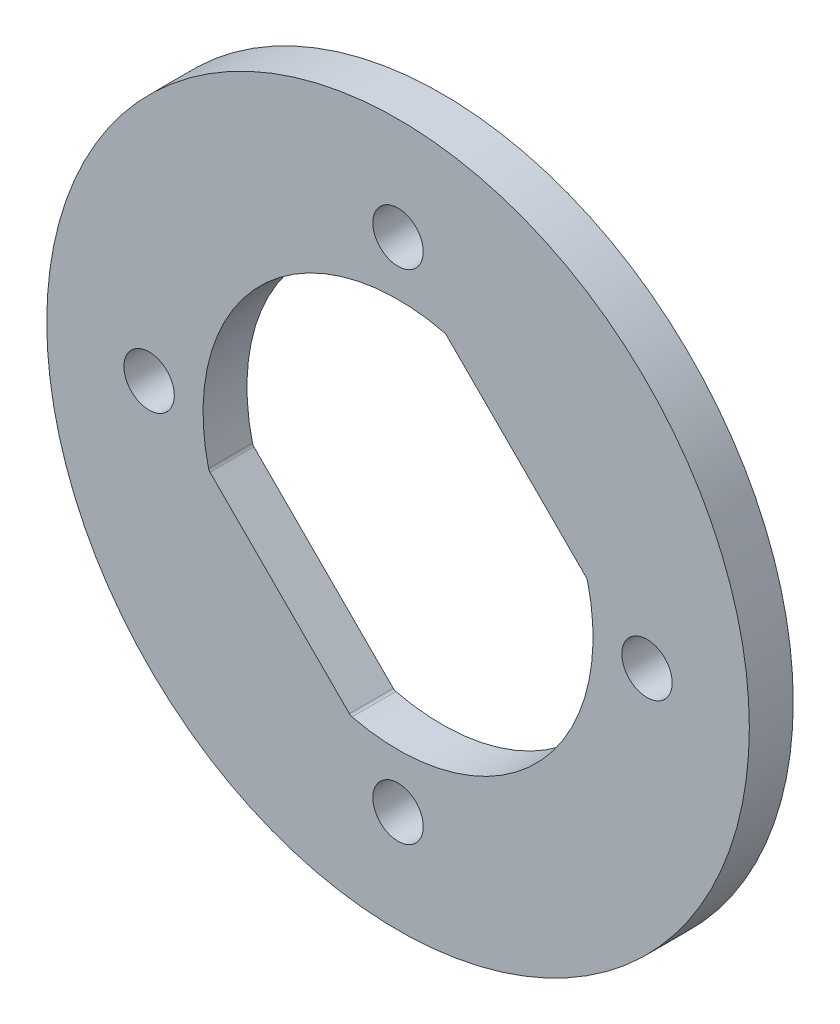
ISO-10303-21;
HEADER;
FILE_DESCRIPTION(('STEP AP214'),'2;1');
FILE_NAME('part.step','',(''),(''),'','','');
FILE_SCHEMA(('AUTOMOTIVE_DESIGN { 1 0 10303 214 1 1 1 1 }'));
ENDSEC;
DATA;
#1=APPLICATION_CONTEXT('core data for automotive mechanical design processes');
#2=APPLICATION_PROTOCOL_DEFINITION('international standard','automotive_design',2000,#1);
#3=PRODUCT_CONTEXT('',#1,'mechanical');
#4=PRODUCT('Part','Part','',(#3));
#5=PRODUCT_RELATED_PRODUCT_CATEGORY('part','',(#4));
#6=PRODUCT_DEFINITION_FORMATION('','',#4);
#7=PRODUCT_DEFINITION_CONTEXT('part definition',#1,'design');
#8=PRODUCT_DEFINITION('design','',#6,#7);
#9=PRODUCT_DEFINITION_SHAPE('','',#8);
#10=(LENGTH_UNIT() NAMED_UNIT(*) SI_UNIT(.MILLI.,.METRE.));
#11=(NAMED_UNIT(*) PLANE_ANGLE_UNIT() SI_UNIT($,.RADIAN.));
#12=(NAMED_UNIT(*) SI_UNIT($,.STERADIAN.) SOLID_ANGLE_UNIT());
#13=UNCERTAINTY_MEASURE_WITH_UNIT(LENGTH_MEASURE(1.E-05),#10,'distance_accuracy_value','');
#14=(GEOMETRIC_REPRESENTATION_CONTEXT(3) GLOBAL_UNCERTAINTY_ASSIGNED_CONTEXT((#13)) GLOBAL_UNIT_ASSIGNED_CONTEXT((#10,
#11,#12)) REPRESENTATION_CONTEXT('',''));
#15=CARTESIAN_POINT('',(0.,0.,0.));
#16=DIRECTION('',(0.,0.,1.));
#17=DIRECTION('',(1.,0.,0.));
#18=AXIS2_PLACEMENT_3D('',#15,#16,#17);
#19=CARTESIAN_POINT('',(-7.54604712049911E-13,-7.61543605953818E-13,1.5875));
#20=DIRECTION('',(0.,0.,-1.));
#21=DIRECTION('',(-1.,0.,0.));
#22=AXIS2_PLACEMENT_3D('',#19,#20,#21);
#23=CYLINDRICAL_SURFACE('',#22,7.05);
#24=CARTESIAN_POINT('',(-7.54604712049911E-13,-7.61543605953818E-13,0.));
#25=DIRECTION('',(0.,0.,1.));
#26=DIRECTION('',(1.,0.,0.));
#27=AXIS2_PLACEMENT_3D('',#24,#25,#26);
#28=CIRCLE('',#27,7.05);
#29=CARTESIAN_POINT('',(-1.66385561397255,-6.85084553145559,0.));
#30=VERTEX_POINT('',#29);
#31=CARTESIAN_POINT('',(6.85084553145407,1.66385561397104,0.));
#32=VERTEX_POINT('',#31);
#33=EDGE_CURVE('E162',#30,#32,#28,.T.);
#34=ORIENTED_EDGE('',*,*,#33,.F.);
#35=DIRECTION('',(0.,0.,-1.));
#36=VECTOR('',#35,1.);
#37=CARTESIAN_POINT('',(-1.66385561397255,-6.85084553145559,1.5875));
#38=LINE('',#37,#36);
#39=CARTESIAN_POINT('',(-1.66385561397255,-6.85084553145559,1.5875));
#40=VERTEX_POINT('',#39);
#41=EDGE_CURVE('E11',#40,#30,#38,.T.);
#42=ORIENTED_EDGE('',*,*,#41,.F.);
#43=CARTESIAN_POINT('',(-7.54604712049911E-13,-7.61543605953818E-13,1.5875));
#44=DIRECTION('',(0.,0.,1.));
#45=DIRECTION('',(1.,0.,0.));
#46=AXIS2_PLACEMENT_3D('',#43,#44,#45);
#47=CIRCLE('',#46,7.05);
#48=CARTESIAN_POINT('',(6.85084553145407,1.66385561397104,1.5875));
#49=VERTEX_POINT('',#48);
#50=EDGE_CURVE('E228',#40,#49,#47,.T.);
#51=ORIENTED_EDGE('',*,*,#50,.T.);
#52=DIRECTION('',(0.,0.,-1.));
#53=VECTOR('',#52,1.);
#54=CARTESIAN_POINT('',(6.85084553145407,1.66385561397104,1.5875));
#55=LINE('',#54,#53);
#56=EDGE_CURVE('E61',#49,#32,#55,.T.);
#57=ORIENTED_EDGE('',*,*,#56,.T.);
#58=EDGE_LOOP('',(#34,#42,#51,#57));
#59=FACE_BOUND('',#58,.T.);
#60=ADVANCED_FACE('F43',(#59),#23,.F.);
#61=CARTESIAN_POINT('',(-1.61665403627122,-6.65649530361289,1.5875));
#62=DIRECTION('',(0.,0.,-1.));
#63=DIRECTION('',(-1.,0.,0.));
#64=AXIS2_PLACEMENT_3D('',#61,#62,#63);
#65=CYLINDRICAL_SURFACE('',#64,0.200000000000006);
#66=CARTESIAN_POINT('',(-1.61665403627122,-6.65649530361289,0.));
#67=DIRECTION('',(0.,0.,1.));
#68=DIRECTION('',(1.,0.,0.));
#69=AXIS2_PLACEMENT_3D('',#66,#67,#68);
#70=CIRCLE('',#69,0.200000000000006);
#71=CARTESIAN_POINT('',(-1.75807539250854,-6.79791665985021,0.));
#72=VERTEX_POINT('',#71);
#73=EDGE_CURVE('E165',#72,#30,#70,.T.);
#74=ORIENTED_EDGE('',*,*,#73,.F.);
#75=DIRECTION('',(0.,0.,-1.));
#76=VECTOR('',#75,1.);
#77=CARTESIAN_POINT('',(-1.75807539250854,-6.79791665985021,1.5875));
#78=LINE('',#77,#76);
#79=CARTESIAN_POINT('',(-1.75807539250854,-6.79791665985021,1.5875));
#80=VERTEX_POINT('',#79);
#81=EDGE_CURVE('E53',#80,#72,#78,.T.);
#82=ORIENTED_EDGE('',*,*,#81,.F.);
#83=CARTESIAN_POINT('',(-1.61665403627122,-6.65649530361289,1.5875));
#84=DIRECTION('',(0.,0.,1.));
#85=DIRECTION('',(1.,0.,0.));
#86=AXIS2_PLACEMENT_3D('',#83,#84,#85);
#87=CIRCLE('',#86,0.200000000000006);
#88=EDGE_CURVE('E222',#80,#40,#87,.T.);
#89=ORIENTED_EDGE('',*,*,#88,.T.);
#90=ORIENTED_EDGE('',*,*,#41,.T.);
#91=EDGE_LOOP('',(#74,#82,#89,#90));
#92=FACE_BOUND('',#91,.T.);
#93=ADVANCED_FACE('F213',(#92),#65,.F.);
#94=CARTESIAN_POINT('',(-4.27799602617937,-4.27799602617938,1.5875));
#95=DIRECTION('',(0.707106781186547,0.707106781186548,0.));
#96=DIRECTION('',(-0.707106781186548,0.707106781186547,0.));
#97=AXIS2_PLACEMENT_3D('',#94,#95,#96);
#98=PLANE('',#97);
#99=DIRECTION('',(0.707106781186548,-0.707106781186547,0.));
#100=VECTOR('',#99,1.);
#101=CARTESIAN_POINT('',(-4.27799602617937,-4.27799602617938,0.));
#102=LINE('',#101,#100);
#103=CARTESIAN_POINT('',(-6.7979166598502,-1.75807539250855,0.));
#104=VERTEX_POINT('',#103);
#105=EDGE_CURVE('E169',#104,#72,#102,.T.);
#106=ORIENTED_EDGE('',*,*,#105,.F.);
#107=DIRECTION('',(0.,0.,-1.));
#108=VECTOR('',#107,1.);
#109=CARTESIAN_POINT('',(-6.7979166598502,-1.75807539250855,1.5875));
#110=LINE('',#109,#108);
#111=CARTESIAN_POINT('',(-6.7979166598502,-1.75807539250855,1.5875));
#112=VERTEX_POINT('',#111);
#113=EDGE_CURVE('E200',#112,#104,#110,.T.);
#114=ORIENTED_EDGE('',*,*,#113,.F.);
#115=DIRECTION('',(0.707106781186548,-0.707106781186547,0.));
#116=VECTOR('',#115,1.);
#117=CARTESIAN_POINT('',(-4.27799602617937,-4.27799602617938,1.5875));
#118=LINE('',#117,#116);
#119=EDGE_CURVE('E209',#112,#80,#118,.T.);
#120=ORIENTED_EDGE('',*,*,#119,.T.);
#121=ORIENTED_EDGE('',*,*,#81,.T.);
#122=EDGE_LOOP('',(#106,#114,#120,#121));
#123=FACE_BOUND('',#122,.T.);
#124=ADVANCED_FACE('F207',(#123),#98,.T.);
#125=CARTESIAN_POINT('',(-6.65649530361288,-1.61665403627123,1.5875));
#126=DIRECTION('',(0.,0.,-1.));
#127=DIRECTION('',(-1.,0.,0.));
#128=AXIS2_PLACEMENT_3D('',#125,#126,#127);
#129=CYLINDRICAL_SURFACE('',#128,0.200000000000004);
#130=CARTESIAN_POINT('',(-6.65649530361288,-1.61665403627123,0.));
#131=DIRECTION('',(0.,0.,1.));
#132=DIRECTION('',(1.,0.,0.));
#133=AXIS2_PLACEMENT_3D('',#130,#131,#132);
#134=CIRCLE('',#133,0.200000000000004);
#135=CARTESIAN_POINT('',(-6.85084553145558,-1.66385561397256,0.));
#136=VERTEX_POINT('',#135);
#137=EDGE_CURVE('E173',#136,#104,#134,.T.);
#138=ORIENTED_EDGE('',*,*,#137,.F.);
#139=DIRECTION('',(0.,0.,-1.));
#140=VECTOR('',#139,1.);
#141=CARTESIAN_POINT('',(-6.85084553145558,-1.66385561397256,1.5875));
#142=LINE('',#141,#140);
#143=CARTESIAN_POINT('',(-6.85084553145558,-1.66385561397256,1.5875));
#144=VERTEX_POINT('',#143);
#145=EDGE_CURVE('E197',#144,#136,#142,.T.);
#146=ORIENTED_EDGE('',*,*,#145,.F.);
#147=CARTESIAN_POINT('',(-6.65649530361288,-1.61665403627123,1.5875));
#148=DIRECTION('',(0.,0.,1.));
#149=DIRECTION('',(1.,0.,0.));
#150=AXIS2_PLACEMENT_3D('',#147,#148,#149);
#151=CIRCLE('',#150,0.200000000000004);
#152=EDGE_CURVE('E221',#144,#112,#151,.T.);
#153=ORIENTED_EDGE('',*,*,#152,.T.);
#154=ORIENTED_EDGE('',*,*,#113,.T.);
#155=EDGE_LOOP('',(#138,#146,#153,#154));
#156=FACE_BOUND('',#155,.T.);
#157=ADVANCED_FACE('F219',(#156),#129,.F.);
#158=CARTESIAN_POINT('',(-7.54604712049911E-13,-7.61543605953818E-13,1.5875));
#159=DIRECTION('',(0.,0.,-1.));
#160=DIRECTION('',(-1.,0.,0.));
#161=AXIS2_PLACEMENT_3D('',#158,#159,#160);
#162=CYLINDRICAL_SURFACE('',#161,7.04999999999999);
#163=CARTESIAN_POINT('',(-7.54604712049911E-13,-7.61543605953818E-13,0.));
#164=DIRECTION('',(0.,0.,1.));
#165=DIRECTION('',(1.,0.,0.));
#166=AXIS2_PLACEMENT_3D('',#163,#164,#165);
#167=CIRCLE('',#166,7.04999999999999);
#168=CARTESIAN_POINT('',(1.66385561397104,6.85084553145406,0.));
#169=VERTEX_POINT('',#168);
#170=EDGE_CURVE('E177',#169,#136,#167,.T.);
#171=ORIENTED_EDGE('',*,*,#170,.F.);
#172=DIRECTION('',(0.,0.,-1.));
#173=VECTOR('',#172,1.);
#174=CARTESIAN_POINT('',(1.66385561397104,6.85084553145406,1.5875));
#175=LINE('',#174,#173);
#176=CARTESIAN_POINT('',(1.66385561397104,6.85084553145406,1.5875));
#177=VERTEX_POINT('',#176);
#178=EDGE_CURVE('E121',#177,#169,#175,.T.);
#179=ORIENTED_EDGE('',*,*,#178,.F.);
#180=CARTESIAN_POINT('',(-7.54604712049911E-13,-7.61543605953818E-13,1.5875));
#181=DIRECTION('',(0.,0.,1.));
#182=DIRECTION('',(1.,0.,0.));
#183=AXIS2_PLACEMENT_3D('',#180,#181,#182);
#184=CIRCLE('',#183,7.04999999999999);
#185=EDGE_CURVE('E131',#177,#144,#184,.T.);
#186=ORIENTED_EDGE('',*,*,#185,.T.);
#187=ORIENTED_EDGE('',*,*,#145,.T.);
#188=EDGE_LOOP('',(#171,#179,#186,#187));
#189=FACE_BOUND('',#188,.T.);
#190=ADVANCED_FACE('F233',(#189),#162,.F.);
#191=CARTESIAN_POINT('',(1.61665403626972,6.65649530361137,1.5875));
#192=DIRECTION('',(0.,0.,-1.));
#193=DIRECTION('',(-1.,0.,0.));
#194=AXIS2_PLACEMENT_3D('',#191,#192,#193);
#195=CYLINDRICAL_SURFACE('',#194,0.2);
#196=CARTESIAN_POINT('',(1.61665403626972,6.65649530361137,0.));
#197=DIRECTION('',(0.,0.,1.));
#198=DIRECTION('',(1.,0.,0.));
#199=AXIS2_PLACEMENT_3D('',#196,#197,#198);
#200=CIRCLE('',#199,0.2);
#201=CARTESIAN_POINT('',(1.75807539250702,6.79791665984868,0.));
#202=VERTEX_POINT('',#201);
#203=EDGE_CURVE('E116',#202,#169,#200,.T.);
#204=ORIENTED_EDGE('',*,*,#203,.F.);
#205=DIRECTION('',(0.,0.,-1.));
#206=VECTOR('',#205,1.);
#207=CARTESIAN_POINT('',(1.75807539250702,6.79791665984868,1.5875));
#208=LINE('',#207,#206);
#209=CARTESIAN_POINT('',(1.75807539250702,6.79791665984868,1.5875));
#210=VERTEX_POINT('',#209);
#211=EDGE_CURVE('E111',#210,#202,#208,.T.);
#212=ORIENTED_EDGE('',*,*,#211,.F.);
#213=CARTESIAN_POINT('',(1.61665403626972,6.65649530361137,1.5875));
#214=DIRECTION('',(0.,0.,1.));
#215=DIRECTION('',(1.,0.,0.));
#216=AXIS2_PLACEMENT_3D('',#213,#214,#215);
#217=CIRCLE('',#216,0.2);
#218=EDGE_CURVE('E114',#210,#177,#217,.T.);
#219=ORIENTED_EDGE('',*,*,#218,.T.);
#220=ORIENTED_EDGE('',*,*,#178,.T.);
#221=EDGE_LOOP('',(#204,#212,#219,#220));
#222=FACE_BOUND('',#221,.T.);
#223=ADVANCED_FACE('F113',(#222),#195,.F.);
#224=CARTESIAN_POINT('',(4.27799602617785,4.27799602617785,1.5875));
#225=DIRECTION('',(-0.707106781186548,-0.707106781186548,0.));
#226=DIRECTION('',(0.707106781186548,-0.707106781186548,0.));
#227=AXIS2_PLACEMENT_3D('',#224,#225,#226);
#228=PLANE('',#227);
#229=DIRECTION('',(-0.707106781186548,0.707106781186548,0.));
#230=VECTOR('',#229,1.);
#231=CARTESIAN_POINT('',(4.27799602617785,4.27799602617785,0.));
#232=LINE('',#231,#230);
#233=CARTESIAN_POINT('',(6.79791665984868,1.75807539250702,0.));
#234=VERTEX_POINT('',#233);
#235=EDGE_CURVE('E183',#234,#202,#232,.T.);
#236=ORIENTED_EDGE('',*,*,#235,.F.);
#237=DIRECTION('',(0.,0.,-1.));
#238=VECTOR('',#237,1.);
#239=CARTESIAN_POINT('',(6.79791665984868,1.75807539250702,1.5875));
#240=LINE('',#239,#238);
#241=CARTESIAN_POINT('',(6.79791665984868,1.75807539250702,1.5875));
#242=VERTEX_POINT('',#241);
#243=EDGE_CURVE('E86',#242,#234,#240,.T.);
#244=ORIENTED_EDGE('',*,*,#243,.F.);
#245=DIRECTION('',(-0.707106781186548,0.707106781186548,0.));
#246=VECTOR('',#245,1.);
#247=CARTESIAN_POINT('',(4.27799602617785,4.27799602617785,1.5875));
#248=LINE('',#247,#246);
#249=EDGE_CURVE('E128',#242,#210,#248,.T.);
#250=ORIENTED_EDGE('',*,*,#249,.T.);
#251=ORIENTED_EDGE('',*,*,#211,.T.);
#252=EDGE_LOOP('',(#236,#244,#250,#251));
#253=FACE_BOUND('',#252,.T.);
#254=ADVANCED_FACE('F134',(#253),#228,.T.);
#255=CARTESIAN_POINT('',(-9.0000001341112,-7.61543605953818E-13,1.5875));
#256=DIRECTION('',(0.,0.,-1.));
#257=DIRECTION('',(-1.,0.,0.));
#258=AXIS2_PLACEMENT_3D('',#255,#256,#257);
#259=CYLINDRICAL_SURFACE('',#258,0.911499999999999);
#260=CARTESIAN_POINT('',(-9.0000001341112,-7.61543605953818E-13,1.5875));
#261=DIRECTION('',(0.,0.,1.));
#262=DIRECTION('',(1.,0.,0.));
#263=AXIS2_PLACEMENT_3D('',#260,#261,#262);
#264=CIRCLE('',#263,0.911499999999999);
#265=CARTESIAN_POINT('',(-8.08850013411121,-7.61543605953818E-13,1.5875));
#266=VERTEX_POINT('',#265);
#267=EDGE_CURVE('E432',#266,#266,#264,.T.);
#268=ORIENTED_EDGE('',*,*,#267,.T.);
#269=EDGE_LOOP('',(#268));
#270=FACE_BOUND('',#269,.T.);
#271=CARTESIAN_POINT('',(-9.0000001341112,-7.61543605953818E-13,0.));
#272=DIRECTION('',(0.,0.,1.));
#273=DIRECTION('',(1.,0.,0.));
#274=AXIS2_PLACEMENT_3D('',#271,#272,#273);
#275=CIRCLE('',#274,0.911499999999999);
#276=CARTESIAN_POINT('',(-8.08850013411121,-7.61543605953818E-13,0.));
#277=VERTEX_POINT('',#276);
#278=EDGE_CURVE('E158',#277,#277,#275,.T.);
#279=ORIENTED_EDGE('',*,*,#278,.F.);
#280=EDGE_LOOP('',(#279));
#281=FACE_BOUND('',#280,.T.);
#282=ADVANCED_FACE('F255',(#270,#281),#259,.F.);
#283=CARTESIAN_POINT('',(-7.54604712049911E-13,-9.00000013411121,1.5875));
#284=DIRECTION('',(0.,0.,-1.));
#285=DIRECTION('',(-1.,0.,0.));
#286=AXIS2_PLACEMENT_3D('',#283,#284,#285);
#287=CYLINDRICAL_SURFACE('',#286,0.911499999999999);
#288=CARTESIAN_POINT('',(-7.54604712049911E-13,-9.00000013411121,1.5875));
#289=DIRECTION('',(0.,0.,1.));
#290=DIRECTION('',(1.,0.,0.));
#291=AXIS2_PLACEMENT_3D('',#288,#289,#290);
#292=CIRCLE('',#291,0.911499999999999);
#293=CARTESIAN_POINT('',(0.911499999999245,-9.00000013411121,1.5875));
#294=VERTEX_POINT('',#293);
#295=EDGE_CURVE('E424',#294,#294,#292,.T.);
#296=ORIENTED_EDGE('',*,*,#295,.T.);
#297=EDGE_LOOP('',(#296));
#298=FACE_BOUND('',#297,.T.);
#299=CARTESIAN_POINT('',(-7.54604712049911E-13,-9.00000013411121,0.));
#300=DIRECTION('',(0.,0.,1.));
#301=DIRECTION('',(1.,0.,0.));
#302=AXIS2_PLACEMENT_3D('',#299,#300,#301);
#303=CIRCLE('',#302,0.911499999999999);
#304=CARTESIAN_POINT('',(0.911499999999245,-9.00000013411121,0.));
#305=VERTEX_POINT('',#304);
#306=EDGE_CURVE('E154',#305,#305,#303,.T.);
#307=ORIENTED_EDGE('',*,*,#306,.F.);
#308=EDGE_LOOP('',(#307));
#309=FACE_BOUND('',#308,.T.);
#310=ADVANCED_FACE('F258',(#298,#309),#287,.F.);
#311=CARTESIAN_POINT('',(9.00000013410969,-7.61543605953818E-13,1.5875));
#312=DIRECTION('',(0.,0.,-1.));
#313=DIRECTION('',(-1.,0.,0.));
#314=AXIS2_PLACEMENT_3D('',#311,#312,#313);
#315=CYLINDRICAL_SURFACE('',#314,0.911500000000003);
#316=CARTESIAN_POINT('',(9.00000013410969,-7.61543605953818E-13,1.5875));
#317=DIRECTION('',(0.,0.,1.));
#318=DIRECTION('',(1.,0.,0.));
#319=AXIS2_PLACEMENT_3D('',#316,#317,#318);
#320=CIRCLE('',#319,0.911500000000003);
#321=CARTESIAN_POINT('',(9.9115001341097,-7.61543605953818E-13,1.5875));
#322=VERTEX_POINT('',#321);
#323=EDGE_CURVE('E419',#322,#322,#320,.T.);
#324=ORIENTED_EDGE('',*,*,#323,.T.);
#325=EDGE_LOOP('',(#324));
#326=FACE_BOUND('',#325,.T.);
#327=CARTESIAN_POINT('',(9.00000013410969,-7.61543605953818E-13,0.));
#328=DIRECTION('',(0.,0.,1.));
#329=DIRECTION('',(1.,0.,0.));
#330=AXIS2_PLACEMENT_3D('',#327,#328,#329);
#331=CIRCLE('',#330,0.911500000000003);
#332=CARTESIAN_POINT('',(9.9115001341097,-7.61543605953818E-13,0.));
#333=VERTEX_POINT('',#332);
#334=EDGE_CURVE('E150',#333,#333,#331,.T.);
#335=ORIENTED_EDGE('',*,*,#334,.F.);
#336=EDGE_LOOP('',(#335));
#337=FACE_BOUND('',#336,.T.);
#338=ADVANCED_FACE('F262',(#326,#337),#315,.F.);
#339=CARTESIAN_POINT('',(-7.54604712049911E-13,9.00000013410969,1.5875));
#340=DIRECTION('',(0.,0.,-1.));
#341=DIRECTION('',(-1.,0.,0.));
#342=AXIS2_PLACEMENT_3D('',#339,#340,#341);
#343=CYLINDRICAL_SURFACE('',#342,0.9115);
#344=CARTESIAN_POINT('',(-7.54604712049911E-13,9.00000013410969,1.5875));
#345=DIRECTION('',(0.,0.,1.));
#346=DIRECTION('',(1.,0.,0.));
#347=AXIS2_PLACEMENT_3D('',#344,#345,#346);
#348=CIRCLE('',#347,0.9115);
#349=CARTESIAN_POINT('',(0.911499999999245,9.00000013410969,1.5875));
#350=VERTEX_POINT('',#349);
#351=EDGE_CURVE('E273',#350,#350,#348,.T.);
#352=ORIENTED_EDGE('',*,*,#351,.T.);
#353=EDGE_LOOP('',(#352));
#354=FACE_BOUND('',#353,.T.);
#355=CARTESIAN_POINT('',(-7.54604712049911E-13,9.00000013410969,0.));
#356=DIRECTION('',(0.,0.,1.));
#357=DIRECTION('',(1.,0.,0.));
#358=AXIS2_PLACEMENT_3D('',#355,#356,#357);
#359=CIRCLE('',#358,0.9115);
#360=CARTESIAN_POINT('',(0.911499999999245,9.00000013410969,0.));
#361=VERTEX_POINT('',#360);
#362=EDGE_CURVE('E146',#361,#361,#359,.T.);
#363=ORIENTED_EDGE('',*,*,#362,.F.);
#364=EDGE_LOOP('',(#363));
#365=FACE_BOUND('',#364,.T.);
#366=ADVANCED_FACE('F243',(#354,#365),#343,.F.);
#367=CARTESIAN_POINT('',(7.63278329429795E-13,-7.54604712049911E-13,1.5875));
#368=DIRECTION('',(0.,0.,-1.));
#369=DIRECTION('',(-1.,0.,0.));
#370=AXIS2_PLACEMENT_3D('',#367,#368,#369);
#371=CYLINDRICAL_SURFACE('',#370,12.7);
#372=CARTESIAN_POINT('',(7.63278329429795E-13,-7.54604712049911E-13,1.5875));
#373=DIRECTION('',(0.,0.,1.));
#374=DIRECTION('',(1.,0.,0.));
#375=AXIS2_PLACEMENT_3D('',#372,#373,#374);
#376=CIRCLE('',#375,12.7);
#377=CARTESIAN_POINT('',(12.7000000000008,-7.54604712049911E-13,1.5875));
#378=VERTEX_POINT('',#377);
#379=EDGE_CURVE('E190',#378,#378,#376,.T.);
#380=ORIENTED_EDGE('',*,*,#379,.F.);
#381=EDGE_LOOP('',(#380));
#382=FACE_BOUND('',#381,.T.);
#383=CARTESIAN_POINT('',(7.63278329429795E-13,-7.54604712049911E-13,0.));
#384=DIRECTION('',(0.,0.,1.));
#385=DIRECTION('',(1.,0.,0.));
#386=AXIS2_PLACEMENT_3D('',#383,#384,#385);
#387=CIRCLE('',#386,12.7);
#388=CARTESIAN_POINT('',(12.7000000000008,-7.54604712049911E-13,0.));
#389=VERTEX_POINT('',#388);
#390=EDGE_CURVE('E142',#389,#389,#387,.T.);
#391=ORIENTED_EDGE('',*,*,#390,.T.);
#392=EDGE_LOOP('',(#391));
#393=FACE_BOUND('',#392,.T.);
#394=ADVANCED_FACE('F45',(#382,#393),#371,.T.);
#395=CARTESIAN_POINT('',(6.65649530361137,1.61665403626971,1.5875));
#396=DIRECTION('',(0.,0.,-1.));
#397=DIRECTION('',(-1.,0.,0.));
#398=AXIS2_PLACEMENT_3D('',#395,#396,#397);
#399=CYLINDRICAL_SURFACE('',#398,0.200000000000002);
#400=CARTESIAN_POINT('',(6.65649530361137,1.61665403626971,0.));
#401=DIRECTION('',(0.,0.,1.));
#402=DIRECTION('',(1.,0.,0.));
#403=AXIS2_PLACEMENT_3D('',#400,#401,#402);
#404=CIRCLE('',#403,0.200000000000002);
#405=EDGE_CURVE('E186',#32,#234,#404,.T.);
#406=ORIENTED_EDGE('',*,*,#405,.F.);
#407=ORIENTED_EDGE('',*,*,#56,.F.);
#408=CARTESIAN_POINT('',(6.65649530361137,1.61665403626971,1.5875));
#409=DIRECTION('',(0.,0.,1.));
#410=DIRECTION('',(1.,0.,0.));
#411=AXIS2_PLACEMENT_3D('',#408,#409,#410);
#412=CIRCLE('',#411,0.200000000000002);
#413=EDGE_CURVE('E136',#49,#242,#412,.T.);
#414=ORIENTED_EDGE('',*,*,#413,.T.);
#415=ORIENTED_EDGE('',*,*,#243,.T.);
#416=EDGE_LOOP('',(#406,#407,#414,#415));
#417=FACE_BOUND('',#416,.T.);
#418=ADVANCED_FACE('F234',(#417),#399,.F.);
#419=CARTESIAN_POINT('',(0.,0.,1.5875));
#420=DIRECTION('',(0.,0.,1.));
#421=DIRECTION('',(1.,0.,0.));
#422=AXIS2_PLACEMENT_3D('',#419,#420,#421);
#423=PLANE('',#422);
#424=ORIENTED_EDGE('',*,*,#379,.T.);
#425=EDGE_LOOP('',(#424));
#426=FACE_BOUND('',#425,.T.);
#427=ORIENTED_EDGE('',*,*,#351,.F.);
#428=EDGE_LOOP('',(#427));
#429=FACE_BOUND('',#428,.T.);
#430=ORIENTED_EDGE('',*,*,#323,.F.);
#431=EDGE_LOOP('',(#430));
#432=FACE_BOUND('',#431,.T.);
#433=ORIENTED_EDGE('',*,*,#295,.F.);
#434=EDGE_LOOP('',(#433));
#435=FACE_BOUND('',#434,.T.);
#436=ORIENTED_EDGE('',*,*,#267,.F.);
#437=EDGE_LOOP('',(#436));
#438=FACE_BOUND('',#437,.T.);
#439=ORIENTED_EDGE('',*,*,#50,.F.);
#440=ORIENTED_EDGE('',*,*,#88,.F.);
#441=ORIENTED_EDGE('',*,*,#119,.F.);
#442=ORIENTED_EDGE('',*,*,#152,.F.);
#443=ORIENTED_EDGE('',*,*,#185,.F.);
#444=ORIENTED_EDGE('',*,*,#218,.F.);
#445=ORIENTED_EDGE('',*,*,#249,.F.);
#446=ORIENTED_EDGE('',*,*,#413,.F.);
#447=EDGE_LOOP('',(#439,#440,#441,#442,#443,#444,#445,#446));
#448=FACE_BOUND('',#447,.T.);
#449=ADVANCED_FACE('F126',(#426,#429,#432,#435,#438,#448),#423,.T.);
#450=CARTESIAN_POINT('',(0.,0.,0.));
#451=DIRECTION('',(0.,0.,1.));
#452=DIRECTION('',(1.,0.,0.));
#453=AXIS2_PLACEMENT_3D('',#450,#451,#452);
#454=PLANE('',#453);
#455=ORIENTED_EDGE('',*,*,#390,.F.);
#456=EDGE_LOOP('',(#455));
#457=FACE_BOUND('',#456,.T.);
#458=ORIENTED_EDGE('',*,*,#362,.T.);
#459=EDGE_LOOP('',(#458));
#460=FACE_BOUND('',#459,.T.);
#461=ORIENTED_EDGE('',*,*,#334,.T.);
#462=EDGE_LOOP('',(#461));
#463=FACE_BOUND('',#462,.T.);
#464=ORIENTED_EDGE('',*,*,#306,.T.);
#465=EDGE_LOOP('',(#464));
#466=FACE_BOUND('',#465,.T.);
#467=ORIENTED_EDGE('',*,*,#278,.T.);
#468=EDGE_LOOP('',(#467));
#469=FACE_BOUND('',#468,.T.);
#470=ORIENTED_EDGE('',*,*,#33,.T.);
#471=ORIENTED_EDGE('',*,*,#405,.T.);
#472=ORIENTED_EDGE('',*,*,#235,.T.);
#473=ORIENTED_EDGE('',*,*,#203,.T.);
#474=ORIENTED_EDGE('',*,*,#170,.T.);
#475=ORIENTED_EDGE('',*,*,#137,.T.);
#476=ORIENTED_EDGE('',*,*,#105,.T.);
#477=ORIENTED_EDGE('',*,*,#73,.T.);
#478=EDGE_LOOP('',(#470,#471,#472,#473,#474,#475,#476,#477));
#479=FACE_BOUND('',#478,.T.);
#480=ADVANCED_FACE('F215',(#457,#460,#463,#466,#469,#479),#454,.F.);
#481=CLOSED_SHELL('',(#60,#93,#124,#157,#190,#223,#254,#282,#310,#338,#366,#394,#418,#449,#480));
#482=MANIFOLD_SOLID_BREP('B2',#481);
#483=ADVANCED_BREP_SHAPE_REPRESENTATION('',(#18,#482),#14);
#484=SHAPE_DEFINITION_REPRESENTATION(#9,#483);
ENDSEC;
END-ISO-10303-21;
